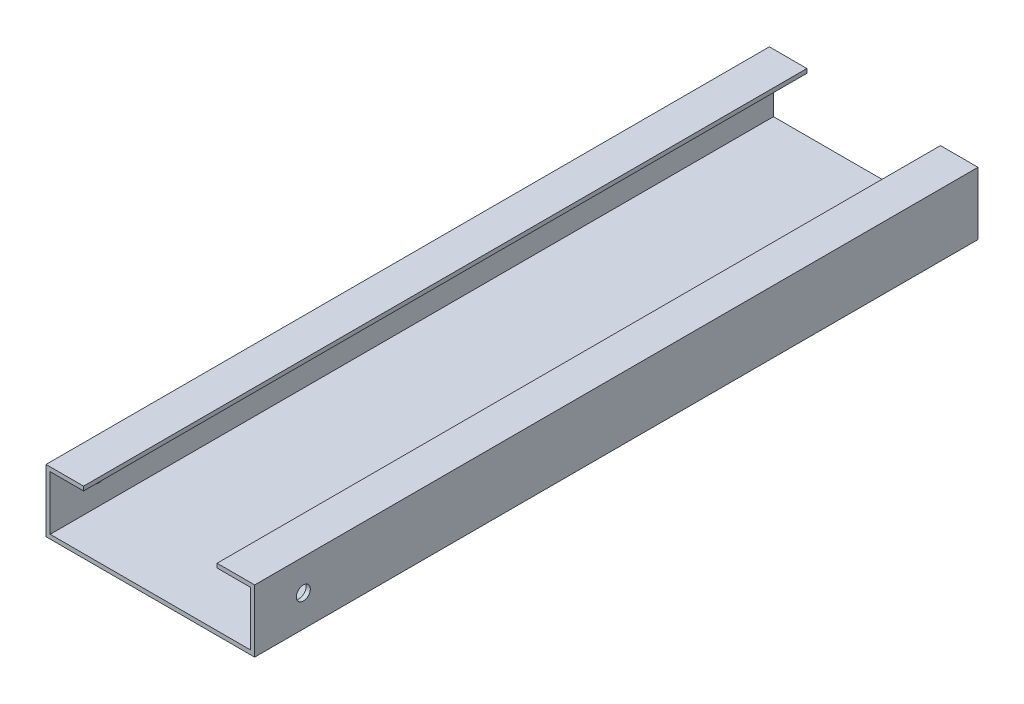
ISO-10303-21;
HEADER;
FILE_DESCRIPTION(('STEP AP214'),'2;1');
FILE_NAME('part.step','',(''),(''),'','','');
FILE_SCHEMA(('AUTOMOTIVE_DESIGN { 1 0 10303 214 1 1 1 1 }'));
ENDSEC;
DATA;
#1=APPLICATION_CONTEXT('core data for automotive mechanical design processes');
#2=APPLICATION_PROTOCOL_DEFINITION('international standard','automotive_design',2000,#1);
#3=PRODUCT_CONTEXT('',#1,'mechanical');
#4=PRODUCT('Part','Part','',(#3));
#5=PRODUCT_RELATED_PRODUCT_CATEGORY('part','',(#4));
#6=PRODUCT_DEFINITION_FORMATION('','',#4);
#7=PRODUCT_DEFINITION_CONTEXT('part definition',#1,'design');
#8=PRODUCT_DEFINITION('design','',#6,#7);
#9=PRODUCT_DEFINITION_SHAPE('','',#8);
#10=(LENGTH_UNIT() NAMED_UNIT(*) SI_UNIT(.MILLI.,.METRE.));
#11=(NAMED_UNIT(*) PLANE_ANGLE_UNIT() SI_UNIT($,.RADIAN.));
#12=(NAMED_UNIT(*) SI_UNIT($,.STERADIAN.) SOLID_ANGLE_UNIT());
#13=UNCERTAINTY_MEASURE_WITH_UNIT(LENGTH_MEASURE(1.E-05),#10,'distance_accuracy_value','');
#14=(GEOMETRIC_REPRESENTATION_CONTEXT(3) GLOBAL_UNCERTAINTY_ASSIGNED_CONTEXT((#13)) GLOBAL_UNIT_ASSIGNED_CONTEXT((#10,
#11,#12)) REPRESENTATION_CONTEXT('',''));
#15=CARTESIAN_POINT('',(0.,0.,0.));
#16=DIRECTION('',(0.,0.,1.));
#17=DIRECTION('',(1.,0.,0.));
#18=AXIS2_PLACEMENT_3D('',#15,#16,#17);
#19=CARTESIAN_POINT('',(-75.,22.5,260.));
#20=DIRECTION('',(0.,-1.,0.));
#21=DIRECTION('',(0.,0.,-1.));
#22=AXIS2_PLACEMENT_3D('',#19,#20,#21);
#23=PLANE('',#22);
#24=DIRECTION('',(-1.,0.,0.));
#25=VECTOR('',#24,1.);
#26=CARTESIAN_POINT('',(-75.,22.5,-260.));
#27=LINE('',#26,#25);
#28=CARTESIAN_POINT('',(75.,22.5,-260.));
#29=VERTEX_POINT('',#28);
#30=CARTESIAN_POINT('',(48.,22.5,-260.));
#31=VERTEX_POINT('',#30);
#32=EDGE_CURVE('E185',#29,#31,#27,.T.);
#33=ORIENTED_EDGE('',*,*,#32,.T.);
#34=DIRECTION('',(0.,0.,1.));
#35=VECTOR('',#34,1.);
#36=CARTESIAN_POINT('',(48.,22.5,260.));
#37=LINE('',#36,#35);
#38=CARTESIAN_POINT('',(48.,22.5,260.));
#39=VERTEX_POINT('',#38);
#40=EDGE_CURVE('E223',#31,#39,#37,.T.);
#41=ORIENTED_EDGE('',*,*,#40,.T.);
#42=DIRECTION('',(-1.,0.,0.));
#43=VECTOR('',#42,1.);
#44=CARTESIAN_POINT('',(-75.,22.5,260.));
#45=LINE('',#44,#43);
#46=CARTESIAN_POINT('',(75.,22.5,260.));
#47=VERTEX_POINT('',#46);
#48=EDGE_CURVE('E133',#47,#39,#45,.T.);
#49=ORIENTED_EDGE('',*,*,#48,.F.);
#50=DIRECTION('',(0.,0.,-1.));
#51=VECTOR('',#50,1.);
#52=CARTESIAN_POINT('',(75.,22.5,260.));
#53=LINE('',#52,#51);
#54=EDGE_CURVE('E199',#47,#29,#53,.T.);
#55=ORIENTED_EDGE('',*,*,#54,.T.);
#56=EDGE_LOOP('',(#33,#41,#49,#55));
#57=FACE_BOUND('',#56,.T.);
#58=ADVANCED_FACE('F32',(#57),#23,.F.);
#59=CARTESIAN_POINT('',(-72.,19.5,-260.));
#60=DIRECTION('',(0.,1.,0.));
#61=DIRECTION('',(0.,0.,1.));
#62=AXIS2_PLACEMENT_3D('',#59,#60,#61);
#63=PLANE('',#62);
#64=DIRECTION('',(-1.,0.,0.));
#65=VECTOR('',#64,1.);
#66=CARTESIAN_POINT('',(-72.,19.5,260.));
#67=LINE('',#66,#65);
#68=CARTESIAN_POINT('',(72.,19.5,260.));
#69=VERTEX_POINT('',#68);
#70=CARTESIAN_POINT('',(48.,19.5,260.));
#71=VERTEX_POINT('',#70);
#72=EDGE_CURVE('E131',#69,#71,#67,.T.);
#73=ORIENTED_EDGE('',*,*,#72,.T.);
#74=DIRECTION('',(0.,0.,-1.));
#75=VECTOR('',#74,1.);
#76=CARTESIAN_POINT('',(48.,19.5,-260.));
#77=LINE('',#76,#75);
#78=CARTESIAN_POINT('',(48.,19.5,-260.));
#79=VERTEX_POINT('',#78);
#80=EDGE_CURVE('E11',#71,#79,#77,.T.);
#81=ORIENTED_EDGE('',*,*,#80,.T.);
#82=DIRECTION('',(-1.,0.,0.));
#83=VECTOR('',#82,1.);
#84=CARTESIAN_POINT('',(-72.,19.5,-260.));
#85=LINE('',#84,#83);
#86=CARTESIAN_POINT('',(72.,19.5,-260.));
#87=VERTEX_POINT('',#86);
#88=EDGE_CURVE('E155',#87,#79,#85,.T.);
#89=ORIENTED_EDGE('',*,*,#88,.F.);
#90=DIRECTION('',(0.,0.,1.));
#91=VECTOR('',#90,1.);
#92=CARTESIAN_POINT('',(72.,19.5,-260.));
#93=LINE('',#92,#91);
#94=EDGE_CURVE('E138',#87,#69,#93,.T.);
#95=ORIENTED_EDGE('',*,*,#94,.T.);
#96=EDGE_LOOP('',(#73,#81,#89,#95));
#97=FACE_BOUND('',#96,.T.);
#98=ADVANCED_FACE('F137',(#97),#63,.F.);
#99=CARTESIAN_POINT('',(75.,22.5,260.));
#100=DIRECTION('',(-1.,0.,0.));
#101=DIRECTION('',(0.,0.,1.));
#102=AXIS2_PLACEMENT_3D('',#99,#100,#101);
#103=PLANE('',#102);
#104=CARTESIAN_POINT('',(75.,0.,225.));
#105=DIRECTION('',(-1.,0.,0.));
#106=DIRECTION('',(0.,0.,1.));
#107=AXIS2_PLACEMENT_3D('',#104,#105,#106);
#108=CIRCLE('',#107,4.99999999999999);
#109=CARTESIAN_POINT('',(75.,0.,230.));
#110=VERTEX_POINT('',#109);
#111=EDGE_CURVE('E303',#110,#110,#108,.T.);
#112=ORIENTED_EDGE('',*,*,#111,.T.);
#113=EDGE_LOOP('',(#112));
#114=FACE_BOUND('',#113,.T.);
#115=DIRECTION('',(0.,1.,0.));
#116=VECTOR('',#115,1.);
#117=CARTESIAN_POINT('',(75.,22.5,-260.));
#118=LINE('',#117,#116);
#119=CARTESIAN_POINT('',(75.,-22.5,-260.));
#120=VERTEX_POINT('',#119);
#121=EDGE_CURVE('E165',#120,#29,#118,.T.);
#122=ORIENTED_EDGE('',*,*,#121,.T.);
#123=ORIENTED_EDGE('',*,*,#54,.F.);
#124=DIRECTION('',(0.,1.,0.));
#125=VECTOR('',#124,1.);
#126=CARTESIAN_POINT('',(75.,22.5,260.));
#127=LINE('',#126,#125);
#128=CARTESIAN_POINT('',(75.,-22.5,260.));
#129=VERTEX_POINT('',#128);
#130=EDGE_CURVE('E172',#129,#47,#127,.T.);
#131=ORIENTED_EDGE('',*,*,#130,.F.);
#132=DIRECTION('',(0.,0.,-1.));
#133=VECTOR('',#132,1.);
#134=CARTESIAN_POINT('',(75.,-22.5,260.));
#135=LINE('',#134,#133);
#136=EDGE_CURVE('E181',#129,#120,#135,.T.);
#137=ORIENTED_EDGE('',*,*,#136,.T.);
#138=EDGE_LOOP('',(#122,#123,#131,#137));
#139=FACE_BOUND('',#138,.T.);
#140=ADVANCED_FACE('F34',(#114,#139),#103,.F.);
#141=CARTESIAN_POINT('',(-48.,22.5,260.));
#142=VERTEX_POINT('',#141);
#143=CARTESIAN_POINT('',(-75.,22.5,260.));
#144=VERTEX_POINT('',#143);
#145=EDGE_CURVE('E174',#142,#144,#45,.T.);
#146=ORIENTED_EDGE('',*,*,#145,.F.);
#147=DIRECTION('',(0.,0.,-1.));
#148=VECTOR('',#147,1.);
#149=CARTESIAN_POINT('',(-48.,22.5,260.));
#150=LINE('',#149,#148);
#151=CARTESIAN_POINT('',(-48.,22.5,-260.));
#152=VERTEX_POINT('',#151);
#153=EDGE_CURVE('E221',#142,#152,#150,.T.);
#154=ORIENTED_EDGE('',*,*,#153,.T.);
#155=CARTESIAN_POINT('',(-75.,22.5,-260.));
#156=VERTEX_POINT('',#155);
#157=EDGE_CURVE('E184',#152,#156,#27,.T.);
#158=ORIENTED_EDGE('',*,*,#157,.T.);
#159=DIRECTION('',(0.,0.,-1.));
#160=VECTOR('',#159,1.);
#161=CARTESIAN_POINT('',(-75.,22.5,260.));
#162=LINE('',#161,#160);
#163=EDGE_CURVE('E196',#144,#156,#162,.T.);
#164=ORIENTED_EDGE('',*,*,#163,.F.);
#165=EDGE_LOOP('',(#146,#154,#158,#164));
#166=FACE_BOUND('',#165,.T.);
#167=ADVANCED_FACE('F246',(#166),#23,.F.);
#168=CARTESIAN_POINT('',(-75.,22.5,260.));
#169=DIRECTION('',(1.,0.,0.));
#170=DIRECTION('',(0.,0.,-1.));
#171=AXIS2_PLACEMENT_3D('',#168,#169,#170);
#172=PLANE('',#171);
#173=CARTESIAN_POINT('',(-75.,0.,225.));
#174=DIRECTION('',(-1.,0.,0.));
#175=DIRECTION('',(0.,0.,1.));
#176=AXIS2_PLACEMENT_3D('',#173,#174,#175);
#177=CIRCLE('',#176,4.99999999999999);
#178=CARTESIAN_POINT('',(-75.,0.,230.));
#179=VERTEX_POINT('',#178);
#180=EDGE_CURVE('E308',#179,#179,#177,.T.);
#181=ORIENTED_EDGE('',*,*,#180,.F.);
#182=EDGE_LOOP('',(#181));
#183=FACE_BOUND('',#182,.T.);
#184=DIRECTION('',(0.,-1.,0.));
#185=VECTOR('',#184,1.);
#186=CARTESIAN_POINT('',(-75.,22.5,-260.));
#187=LINE('',#186,#185);
#188=CARTESIAN_POINT('',(-75.,-22.5,-260.));
#189=VERTEX_POINT('',#188);
#190=EDGE_CURVE('E188',#156,#189,#187,.T.);
#191=ORIENTED_EDGE('',*,*,#190,.T.);
#192=DIRECTION('',(0.,0.,-1.));
#193=VECTOR('',#192,1.);
#194=CARTESIAN_POINT('',(-75.,-22.5,260.));
#195=LINE('',#194,#193);
#196=CARTESIAN_POINT('',(-75.,-22.5,260.));
#197=VERTEX_POINT('',#196);
#198=EDGE_CURVE('E193',#197,#189,#195,.T.);
#199=ORIENTED_EDGE('',*,*,#198,.F.);
#200=DIRECTION('',(0.,-1.,0.));
#201=VECTOR('',#200,1.);
#202=CARTESIAN_POINT('',(-75.,22.5,260.));
#203=LINE('',#202,#201);
#204=EDGE_CURVE('E177',#144,#197,#203,.T.);
#205=ORIENTED_EDGE('',*,*,#204,.F.);
#206=ORIENTED_EDGE('',*,*,#163,.T.);
#207=EDGE_LOOP('',(#191,#199,#205,#206));
#208=FACE_BOUND('',#207,.T.);
#209=ADVANCED_FACE('F253',(#183,#208),#172,.F.);
#210=CARTESIAN_POINT('',(-75.,-22.5,260.));
#211=DIRECTION('',(0.,1.,0.));
#212=DIRECTION('',(0.,0.,1.));
#213=AXIS2_PLACEMENT_3D('',#210,#211,#212);
#214=PLANE('',#213);
#215=DIRECTION('',(1.,0.,0.));
#216=VECTOR('',#215,1.);
#217=CARTESIAN_POINT('',(-75.,-22.5,-260.));
#218=LINE('',#217,#216);
#219=EDGE_CURVE('E175',#189,#120,#218,.T.);
#220=ORIENTED_EDGE('',*,*,#219,.T.);
#221=ORIENTED_EDGE('',*,*,#136,.F.);
#222=DIRECTION('',(1.,0.,0.));
#223=VECTOR('',#222,1.);
#224=CARTESIAN_POINT('',(-75.,-22.5,260.));
#225=LINE('',#224,#223);
#226=EDGE_CURVE('E179',#197,#129,#225,.T.);
#227=ORIENTED_EDGE('',*,*,#226,.F.);
#228=ORIENTED_EDGE('',*,*,#198,.T.);
#229=EDGE_LOOP('',(#220,#221,#227,#228));
#230=FACE_BOUND('',#229,.T.);
#231=ADVANCED_FACE('F259',(#230),#214,.F.);
#232=CARTESIAN_POINT('',(0.,0.,260.));
#233=DIRECTION('',(0.,0.,1.));
#234=DIRECTION('',(1.,0.,0.));
#235=AXIS2_PLACEMENT_3D('',#232,#233,#234);
#236=PLANE('',#235);
#237=DIRECTION('',(0.,1.,0.));
#238=VECTOR('',#237,1.);
#239=CARTESIAN_POINT('',(48.,28.3789272917114,260.));
#240=LINE('',#239,#238);
#241=EDGE_CURVE('E120',#71,#39,#240,.T.);
#242=ORIENTED_EDGE('',*,*,#241,.F.);
#243=ORIENTED_EDGE('',*,*,#72,.F.);
#244=DIRECTION('',(0.,1.,0.));
#245=VECTOR('',#244,1.);
#246=CARTESIAN_POINT('',(72.,19.5,260.));
#247=LINE('',#246,#245);
#248=CARTESIAN_POINT('',(72.,-19.5,260.));
#249=VERTEX_POINT('',#248);
#250=EDGE_CURVE('E145',#249,#69,#247,.T.);
#251=ORIENTED_EDGE('',*,*,#250,.F.);
#252=DIRECTION('',(1.,0.,0.));
#253=VECTOR('',#252,1.);
#254=CARTESIAN_POINT('',(-72.,-19.5,260.));
#255=LINE('',#254,#253);
#256=CARTESIAN_POINT('',(-72.,-19.5,260.));
#257=VERTEX_POINT('',#256);
#258=EDGE_CURVE('E143',#257,#249,#255,.T.);
#259=ORIENTED_EDGE('',*,*,#258,.F.);
#260=DIRECTION('',(0.,-1.,0.));
#261=VECTOR('',#260,1.);
#262=CARTESIAN_POINT('',(-72.,19.5,260.));
#263=LINE('',#262,#261);
#264=CARTESIAN_POINT('',(-72.,19.5,260.));
#265=VERTEX_POINT('',#264);
#266=EDGE_CURVE('E139',#265,#257,#263,.T.);
#267=ORIENTED_EDGE('',*,*,#266,.F.);
#268=CARTESIAN_POINT('',(-48.,19.5,260.));
#269=VERTEX_POINT('',#268);
#270=EDGE_CURVE('E140',#269,#265,#67,.T.);
#271=ORIENTED_EDGE('',*,*,#270,.F.);
#272=DIRECTION('',(0.,-1.,0.));
#273=VECTOR('',#272,1.);
#274=CARTESIAN_POINT('',(-48.,28.3789272917114,260.));
#275=LINE('',#274,#273);
#276=EDGE_CURVE('E48',#142,#269,#275,.T.);
#277=ORIENTED_EDGE('',*,*,#276,.F.);
#278=ORIENTED_EDGE('',*,*,#145,.T.);
#279=ORIENTED_EDGE('',*,*,#204,.T.);
#280=ORIENTED_EDGE('',*,*,#226,.T.);
#281=ORIENTED_EDGE('',*,*,#130,.T.);
#282=ORIENTED_EDGE('',*,*,#48,.T.);
#283=EDGE_LOOP('',(#242,#243,#251,#259,#267,#271,#277,#278,#279,#280,#281,#282));
#284=FACE_BOUND('',#283,.T.);
#285=ADVANCED_FACE('F129',(#284),#236,.T.);
#286=CARTESIAN_POINT('',(0.,0.,-260.));
#287=DIRECTION('',(0.,0.,1.));
#288=DIRECTION('',(1.,0.,0.));
#289=AXIS2_PLACEMENT_3D('',#286,#287,#288);
#290=PLANE('',#289);
#291=ORIENTED_EDGE('',*,*,#88,.T.);
#292=DIRECTION('',(0.,1.,0.));
#293=VECTOR('',#292,1.);
#294=CARTESIAN_POINT('',(48.,28.3789272917114,-260.));
#295=LINE('',#294,#293);
#296=EDGE_CURVE('E56',#79,#31,#295,.T.);
#297=ORIENTED_EDGE('',*,*,#296,.T.);
#298=ORIENTED_EDGE('',*,*,#32,.F.);
#299=ORIENTED_EDGE('',*,*,#121,.F.);
#300=ORIENTED_EDGE('',*,*,#219,.F.);
#301=ORIENTED_EDGE('',*,*,#190,.F.);
#302=ORIENTED_EDGE('',*,*,#157,.F.);
#303=DIRECTION('',(0.,-1.,0.));
#304=VECTOR('',#303,1.);
#305=CARTESIAN_POINT('',(-48.,28.3789272917114,-260.));
#306=LINE('',#305,#304);
#307=CARTESIAN_POINT('',(-48.,19.5,-260.));
#308=VERTEX_POINT('',#307);
#309=EDGE_CURVE('E218',#152,#308,#306,.T.);
#310=ORIENTED_EDGE('',*,*,#309,.T.);
#311=CARTESIAN_POINT('',(-72.,19.5,-260.));
#312=VERTEX_POINT('',#311);
#313=EDGE_CURVE('E154',#308,#312,#85,.T.);
#314=ORIENTED_EDGE('',*,*,#313,.T.);
#315=DIRECTION('',(0.,-1.,0.));
#316=VECTOR('',#315,1.);
#317=CARTESIAN_POINT('',(-72.,19.5,-260.));
#318=LINE('',#317,#316);
#319=CARTESIAN_POINT('',(-72.,-19.5,-260.));
#320=VERTEX_POINT('',#319);
#321=EDGE_CURVE('E157',#312,#320,#318,.T.);
#322=ORIENTED_EDGE('',*,*,#321,.T.);
#323=DIRECTION('',(1.,0.,0.));
#324=VECTOR('',#323,1.);
#325=CARTESIAN_POINT('',(-72.,-19.5,-260.));
#326=LINE('',#325,#324);
#327=CARTESIAN_POINT('',(72.,-19.5,-260.));
#328=VERTEX_POINT('',#327);
#329=EDGE_CURVE('E160',#320,#328,#326,.T.);
#330=ORIENTED_EDGE('',*,*,#329,.T.);
#331=DIRECTION('',(0.,1.,0.));
#332=VECTOR('',#331,1.);
#333=CARTESIAN_POINT('',(72.,19.5,-260.));
#334=LINE('',#333,#332);
#335=EDGE_CURVE('E151',#328,#87,#334,.T.);
#336=ORIENTED_EDGE('',*,*,#335,.T.);
#337=EDGE_LOOP('',(#291,#297,#298,#299,#300,#301,#302,#310,#314,#322,#330,#336));
#338=FACE_BOUND('',#337,.T.);
#339=ADVANCED_FACE('F216',(#338),#290,.F.);
#340=CARTESIAN_POINT('',(72.,19.5,-260.));
#341=DIRECTION('',(1.,0.,0.));
#342=DIRECTION('',(0.,0.,-1.));
#343=AXIS2_PLACEMENT_3D('',#340,#341,#342);
#344=PLANE('',#343);
#345=CARTESIAN_POINT('',(72.,0.,225.));
#346=DIRECTION('',(1.,0.,0.));
#347=DIRECTION('',(0.,0.,-1.));
#348=AXIS2_PLACEMENT_3D('',#345,#346,#347);
#349=CIRCLE('',#348,4.99999999999999);
#350=CARTESIAN_POINT('',(72.,0.,220.));
#351=VERTEX_POINT('',#350);
#352=EDGE_CURVE('E134',#351,#351,#349,.T.);
#353=ORIENTED_EDGE('',*,*,#352,.T.);
#354=EDGE_LOOP('',(#353));
#355=FACE_BOUND('',#354,.T.);
#356=ORIENTED_EDGE('',*,*,#94,.F.);
#357=ORIENTED_EDGE('',*,*,#335,.F.);
#358=DIRECTION('',(0.,0.,1.));
#359=VECTOR('',#358,1.);
#360=CARTESIAN_POINT('',(72.,-19.5,-260.));
#361=LINE('',#360,#359);
#362=EDGE_CURVE('E163',#328,#249,#361,.T.);
#363=ORIENTED_EDGE('',*,*,#362,.T.);
#364=ORIENTED_EDGE('',*,*,#250,.T.);
#365=EDGE_LOOP('',(#356,#357,#363,#364));
#366=FACE_BOUND('',#365,.T.);
#367=ADVANCED_FACE('F230',(#355,#366),#344,.F.);
#368=CARTESIAN_POINT('',(-72.,-19.5,-260.));
#369=DIRECTION('',(0.,-1.,0.));
#370=DIRECTION('',(0.,0.,-1.));
#371=AXIS2_PLACEMENT_3D('',#368,#369,#370);
#372=PLANE('',#371);
#373=ORIENTED_EDGE('',*,*,#362,.F.);
#374=ORIENTED_EDGE('',*,*,#329,.F.);
#375=DIRECTION('',(0.,0.,1.));
#376=VECTOR('',#375,1.);
#377=CARTESIAN_POINT('',(-72.,-19.5,-260.));
#378=LINE('',#377,#376);
#379=EDGE_CURVE('E166',#320,#257,#378,.T.);
#380=ORIENTED_EDGE('',*,*,#379,.T.);
#381=ORIENTED_EDGE('',*,*,#258,.T.);
#382=EDGE_LOOP('',(#373,#374,#380,#381));
#383=FACE_BOUND('',#382,.T.);
#384=ADVANCED_FACE('F233',(#383),#372,.F.);
#385=CARTESIAN_POINT('',(-72.,19.5,-260.));
#386=DIRECTION('',(-1.,0.,0.));
#387=DIRECTION('',(0.,0.,1.));
#388=AXIS2_PLACEMENT_3D('',#385,#386,#387);
#389=PLANE('',#388);
#390=CARTESIAN_POINT('',(-72.,0.,225.));
#391=DIRECTION('',(-1.,0.,0.));
#392=DIRECTION('',(0.,0.,1.));
#393=AXIS2_PLACEMENT_3D('',#390,#391,#392);
#394=CIRCLE('',#393,4.99999999999999);
#395=CARTESIAN_POINT('',(-72.,0.,230.));
#396=VERTEX_POINT('',#395);
#397=EDGE_CURVE('E36',#396,#396,#394,.T.);
#398=ORIENTED_EDGE('',*,*,#397,.T.);
#399=EDGE_LOOP('',(#398));
#400=FACE_BOUND('',#399,.T.);
#401=ORIENTED_EDGE('',*,*,#379,.F.);
#402=ORIENTED_EDGE('',*,*,#321,.F.);
#403=DIRECTION('',(0.,0.,1.));
#404=VECTOR('',#403,1.);
#405=CARTESIAN_POINT('',(-72.,19.5,-260.));
#406=LINE('',#405,#404);
#407=EDGE_CURVE('E168',#312,#265,#406,.T.);
#408=ORIENTED_EDGE('',*,*,#407,.T.);
#409=ORIENTED_EDGE('',*,*,#266,.T.);
#410=EDGE_LOOP('',(#401,#402,#408,#409));
#411=FACE_BOUND('',#410,.T.);
#412=ADVANCED_FACE('F212',(#400,#411),#389,.F.);
#413=ORIENTED_EDGE('',*,*,#313,.F.);
#414=DIRECTION('',(0.,0.,1.));
#415=VECTOR('',#414,1.);
#416=CARTESIAN_POINT('',(-48.,19.5,-260.));
#417=LINE('',#416,#415);
#418=EDGE_CURVE('E41',#308,#269,#417,.T.);
#419=ORIENTED_EDGE('',*,*,#418,.T.);
#420=ORIENTED_EDGE('',*,*,#270,.T.);
#421=ORIENTED_EDGE('',*,*,#407,.F.);
#422=EDGE_LOOP('',(#413,#419,#420,#421));
#423=FACE_BOUND('',#422,.T.);
#424=ADVANCED_FACE('F205',(#423),#63,.F.);
#425=CARTESIAN_POINT('',(-48.,28.3789272917114,-260.));
#426=DIRECTION('',(-1.,0.,0.));
#427=DIRECTION('',(0.,-1.,0.));
#428=AXIS2_PLACEMENT_3D('',#425,#426,#427);
#429=PLANE('',#428);
#430=ORIENTED_EDGE('',*,*,#276,.T.);
#431=ORIENTED_EDGE('',*,*,#418,.F.);
#432=ORIENTED_EDGE('',*,*,#309,.F.);
#433=ORIENTED_EDGE('',*,*,#153,.F.);
#434=EDGE_LOOP('',(#430,#431,#432,#433));
#435=FACE_BOUND('',#434,.T.);
#436=ADVANCED_FACE('F283',(#435),#429,.F.);
#437=CARTESIAN_POINT('',(48.,28.3789272917114,-260.));
#438=DIRECTION('',(1.,0.,0.));
#439=DIRECTION('',(0.,1.,0.));
#440=AXIS2_PLACEMENT_3D('',#437,#438,#439);
#441=PLANE('',#440);
#442=ORIENTED_EDGE('',*,*,#296,.F.);
#443=ORIENTED_EDGE('',*,*,#80,.F.);
#444=ORIENTED_EDGE('',*,*,#241,.T.);
#445=ORIENTED_EDGE('',*,*,#40,.F.);
#446=EDGE_LOOP('',(#442,#443,#444,#445));
#447=FACE_BOUND('',#446,.T.);
#448=ADVANCED_FACE('F119',(#447),#441,.F.);
#449=CARTESIAN_POINT('',(75.,0.,225.));
#450=DIRECTION('',(-1.,0.,0.));
#451=DIRECTION('',(0.,0.,1.));
#452=AXIS2_PLACEMENT_3D('',#449,#450,#451);
#453=CYLINDRICAL_SURFACE('',#452,4.99999999999999);
#454=ORIENTED_EDGE('',*,*,#180,.T.);
#455=EDGE_LOOP('',(#454));
#456=FACE_BOUND('',#455,.T.);
#457=ORIENTED_EDGE('',*,*,#397,.F.);
#458=EDGE_LOOP('',(#457));
#459=FACE_BOUND('',#458,.T.);
#460=ADVANCED_FACE('F291',(#456,#459),#453,.F.);
#461=ORIENTED_EDGE('',*,*,#111,.F.);
#462=EDGE_LOOP('',(#461));
#463=FACE_BOUND('',#462,.T.);
#464=ORIENTED_EDGE('',*,*,#352,.F.);
#465=EDGE_LOOP('',(#464));
#466=FACE_BOUND('',#465,.T.);
#467=ADVANCED_FACE('F293',(#463,#466),#453,.F.);
#468=CLOSED_SHELL('',(#58,#98,#140,#167,#209,#231,#285,#339,#367,#384,#412,#424,#436,#448,#460,#467));
#469=MANIFOLD_SOLID_BREP('B2',#468);
#470=ADVANCED_BREP_SHAPE_REPRESENTATION('',(#18,#469),#14);
#471=SHAPE_DEFINITION_REPRESENTATION(#9,#470);
ENDSEC;
END-ISO-10303-21;
